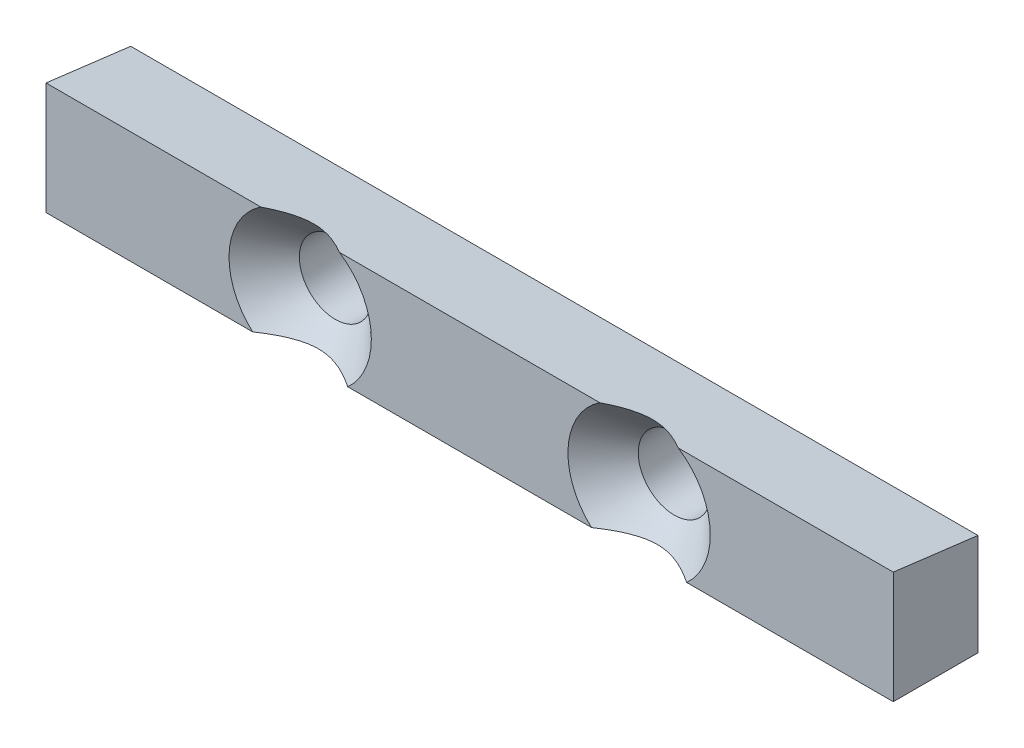
ISO-10303-21;
HEADER;
FILE_DESCRIPTION(('STEP AP214'),'2;1');
FILE_NAME('part.step','',(''),(''),'','','');
FILE_SCHEMA(('AUTOMOTIVE_DESIGN { 1 0 10303 214 1 1 1 1 }'));
ENDSEC;
DATA;
#1=APPLICATION_CONTEXT('core data for automotive mechanical design processes');
#2=APPLICATION_PROTOCOL_DEFINITION('international standard','automotive_design',2000,#1);
#3=PRODUCT_CONTEXT('',#1,'mechanical');
#4=PRODUCT('Part','Part','',(#3));
#5=PRODUCT_RELATED_PRODUCT_CATEGORY('part','',(#4));
#6=PRODUCT_DEFINITION_FORMATION('','',#4);
#7=PRODUCT_DEFINITION_CONTEXT('part definition',#1,'design');
#8=PRODUCT_DEFINITION('design','',#6,#7);
#9=PRODUCT_DEFINITION_SHAPE('','',#8);
#10=(LENGTH_UNIT() NAMED_UNIT(*) SI_UNIT(.MILLI.,.METRE.));
#11=(NAMED_UNIT(*) PLANE_ANGLE_UNIT() SI_UNIT($,.RADIAN.));
#12=(NAMED_UNIT(*) SI_UNIT($,.STERADIAN.) SOLID_ANGLE_UNIT());
#13=UNCERTAINTY_MEASURE_WITH_UNIT(LENGTH_MEASURE(1.E-05),#10,'distance_accuracy_value','');
#14=(GEOMETRIC_REPRESENTATION_CONTEXT(3) GLOBAL_UNCERTAINTY_ASSIGNED_CONTEXT((#13)) GLOBAL_UNIT_ASSIGNED_CONTEXT((#10,
#11,#12)) REPRESENTATION_CONTEXT('',''));
#15=CARTESIAN_POINT('',(0.,0.,0.));
#16=DIRECTION('',(0.,0.,1.));
#17=DIRECTION('',(1.,0.,0.));
#18=AXIS2_PLACEMENT_3D('',#15,#16,#17);
#19=CARTESIAN_POINT('',(0.,0.,4.));
#20=DIRECTION('',(0.,0.,-1.));
#21=DIRECTION('',(-1.,0.,0.));
#22=AXIS2_PLACEMENT_3D('',#19,#20,#21);
#23=PLANE('',#22);
#24=CARTESIAN_POINT('',(12.,2.5,4.));
#25=DIRECTION('',(0.,0.,1.));
#26=DIRECTION('',(1.,0.,0.));
#27=AXIS2_PLACEMENT_3D('',#24,#25,#26);
#28=CIRCLE('',#27,3.36);
#29=CARTESIAN_POINT('',(10.142690117401,5.3,4.));
#30=VERTEX_POINT('',#29);
#31=CARTESIAN_POINT('',(9.75509465678395,0.,4.));
#32=VERTEX_POINT('',#31);
#33=EDGE_CURVE('E54',#30,#32,#28,.T.);
#34=ORIENTED_EDGE('',*,*,#33,.F.);
#35=DIRECTION('',(-1.,0.,0.));
#36=VECTOR('',#35,1.);
#37=CARTESIAN_POINT('',(0.,5.3,4.));
#38=LINE('',#37,#36);
#39=CARTESIAN_POINT('',(0.,5.3,4.));
#40=VERTEX_POINT('',#39);
#41=EDGE_CURVE('E115',#30,#40,#38,.T.);
#42=ORIENTED_EDGE('',*,*,#41,.T.);
#43=DIRECTION('',(0.,-1.,0.));
#44=VECTOR('',#43,1.);
#45=CARTESIAN_POINT('',(0.,0.,4.));
#46=LINE('',#45,#44);
#47=CARTESIAN_POINT('',(0.,0.,4.));
#48=VERTEX_POINT('',#47);
#49=EDGE_CURVE('E137',#40,#48,#46,.T.);
#50=ORIENTED_EDGE('',*,*,#49,.T.);
#51=DIRECTION('',(1.,0.,0.));
#52=VECTOR('',#51,1.);
#53=CARTESIAN_POINT('',(0.,0.,4.));
#54=LINE('',#53,#52);
#55=EDGE_CURVE('E223',#48,#32,#54,.T.);
#56=ORIENTED_EDGE('',*,*,#55,.T.);
#57=EDGE_LOOP('',(#34,#42,#50,#56));
#58=FACE_BOUND('',#57,.T.);
#59=ADVANCED_FACE('F35',(#58),#23,.F.);
#60=CARTESIAN_POINT('',(14.2449053432161,0.,4.));
#61=VERTEX_POINT('',#60);
#62=CARTESIAN_POINT('',(13.857309882599,5.3,4.));
#63=VERTEX_POINT('',#62);
#64=EDGE_CURVE('E102',#61,#63,#28,.T.);
#65=ORIENTED_EDGE('',*,*,#64,.F.);
#66=CARTESIAN_POINT('',(25.755094656784,0.,4.));
#67=VERTEX_POINT('',#66);
#68=EDGE_CURVE('E61',#61,#67,#54,.T.);
#69=ORIENTED_EDGE('',*,*,#68,.T.);
#70=CARTESIAN_POINT('',(28.,2.5,4.));
#71=DIRECTION('',(0.,0.,1.));
#72=DIRECTION('',(1.,0.,0.));
#73=AXIS2_PLACEMENT_3D('',#70,#71,#72);
#74=CIRCLE('',#73,3.36);
#75=CARTESIAN_POINT('',(26.142690117401,5.3,4.));
#76=VERTEX_POINT('',#75);
#77=EDGE_CURVE('E120',#76,#67,#74,.T.);
#78=ORIENTED_EDGE('',*,*,#77,.F.);
#79=EDGE_CURVE('E113',#76,#63,#38,.T.);
#80=ORIENTED_EDGE('',*,*,#79,.T.);
#81=EDGE_LOOP('',(#65,#69,#78,#80));
#82=FACE_BOUND('',#81,.T.);
#83=ADVANCED_FACE('F119',(#82),#23,.F.);
#84=CARTESIAN_POINT('',(30.2449053432161,0.,4.));
#85=VERTEX_POINT('',#84);
#86=CARTESIAN_POINT('',(29.857309882599,5.3,4.));
#87=VERTEX_POINT('',#86);
#88=EDGE_CURVE('E116',#85,#87,#74,.T.);
#89=ORIENTED_EDGE('',*,*,#88,.F.);
#90=CARTESIAN_POINT('',(40.,0.,4.));
#91=VERTEX_POINT('',#90);
#92=EDGE_CURVE('E220',#85,#91,#54,.T.);
#93=ORIENTED_EDGE('',*,*,#92,.T.);
#94=DIRECTION('',(0.,1.,0.));
#95=VECTOR('',#94,1.);
#96=CARTESIAN_POINT('',(40.,0.,4.));
#97=LINE('',#96,#95);
#98=CARTESIAN_POINT('',(40.,5.3,4.));
#99=VERTEX_POINT('',#98);
#100=EDGE_CURVE('E125',#91,#99,#97,.T.);
#101=ORIENTED_EDGE('',*,*,#100,.T.);
#102=EDGE_CURVE('E121',#99,#87,#38,.T.);
#103=ORIENTED_EDGE('',*,*,#102,.T.);
#104=EDGE_LOOP('',(#89,#93,#101,#103));
#105=FACE_BOUND('',#104,.T.);
#106=ADVANCED_FACE('F168',(#105),#23,.F.);
#107=CARTESIAN_POINT('',(0.,0.,4.));
#108=DIRECTION('',(1.,0.,0.));
#109=DIRECTION('',(0.,0.,-1.));
#110=AXIS2_PLACEMENT_3D('',#107,#108,#109);
#111=PLANE('',#110);
#112=ORIENTED_EDGE('',*,*,#49,.F.);
#113=DIRECTION('',(0.,-0.124034734589208,-0.992277876713668));
#114=VECTOR('',#113,1.);
#115=CARTESIAN_POINT('',(0.,4.8,0.));
#116=LINE('',#115,#114);
#117=CARTESIAN_POINT('',(0.,4.8,0.));
#118=VERTEX_POINT('',#117);
#119=EDGE_CURVE('E212',#40,#118,#116,.T.);
#120=ORIENTED_EDGE('',*,*,#119,.T.);
#121=DIRECTION('',(0.,-1.,0.));
#122=VECTOR('',#121,1.);
#123=CARTESIAN_POINT('',(0.,0.,0.));
#124=LINE('',#123,#122);
#125=CARTESIAN_POINT('',(0.,0.,0.));
#126=VERTEX_POINT('',#125);
#127=EDGE_CURVE('E129',#118,#126,#124,.T.);
#128=ORIENTED_EDGE('',*,*,#127,.T.);
#129=DIRECTION('',(0.,0.,-1.));
#130=VECTOR('',#129,1.);
#131=CARTESIAN_POINT('',(0.,0.,4.));
#132=LINE('',#131,#130);
#133=EDGE_CURVE('E140',#48,#126,#132,.T.);
#134=ORIENTED_EDGE('',*,*,#133,.F.);
#135=EDGE_LOOP('',(#112,#120,#128,#134));
#136=FACE_BOUND('',#135,.T.);
#137=ADVANCED_FACE('F37',(#136),#111,.F.);
#138=CARTESIAN_POINT('',(0.,0.,4.));
#139=DIRECTION('',(0.,1.,0.));
#140=DIRECTION('',(0.,0.,1.));
#141=AXIS2_PLACEMENT_3D('',#138,#139,#140);
#142=PLANE('',#141);
#143=ORIENTED_EDGE('',*,*,#68,.F.);
#144=CARTESIAN_POINT('',(7.10959414267506,0.,6.13236465007179));
#145=CARTESIAN_POINT('',(7.22257672798043,0.,6.03178052000878));
#146=CARTESIAN_POINT('',(7.33590490392407,0.,5.93158089696772));
#147=CARTESIAN_POINT('',(7.56343593333905,0.,5.73215625210405));
#148=CARTESIAN_POINT('',(7.67763887687024,0.,5.63293133309703));
#149=CARTESIAN_POINT('',(7.90756722529896,0.,5.43526341119713));
#150=CARTESIAN_POINT('',(8.02329703901976,0.,5.33682552709668));
#151=CARTESIAN_POINT('',(8.25603143741055,0.,5.14147696706215));
#152=CARTESIAN_POINT('',(8.37303596138781,0.,5.04456621894948));
#153=CARTESIAN_POINT('',(8.61550039812195,0.,4.84708900389199));
#154=CARTESIAN_POINT('',(8.7410554428895,0.,4.74663899146112));
#155=CARTESIAN_POINT('',(8.99441364950858,0.,4.54861817784382));
#156=CARTESIAN_POINT('',(9.12221667016262,0.,4.45104719684616));
#157=CARTESIAN_POINT('',(9.38050552195276,0.,4.25997314367807));
#158=CARTESIAN_POINT('',(9.5109864117464,0.,4.16646342460601));
#159=CARTESIAN_POINT('',(9.77566943198212,0.,3.98489838633695));
#160=CARTESIAN_POINT('',(9.90987023405457,0.,3.89684115549075));
#161=CARTESIAN_POINT('',(10.1424054126427,0.,3.75367499047655));
#162=CARTESIAN_POINT('',(10.2395045849948,0.,3.69656988049931));
#163=CARTESIAN_POINT('',(10.4365966693813,0.,3.58745400729232));
#164=CARTESIAN_POINT('',(10.5365904938607,0.,3.53544487356239));
#165=CARTESIAN_POINT('',(10.7390152956502,0.,3.43861547546684));
#166=CARTESIAN_POINT('',(10.8414190155523,0.,3.39373890977025));
#167=CARTESIAN_POINT('',(11.0496687589402,0.,3.31281715643526));
#168=CARTESIAN_POINT('',(11.1555124646676,0.,3.2767661566176));
#169=CARTESIAN_POINT('',(11.3357110529208,0.,3.22580962828511));
#170=CARTESIAN_POINT('',(11.409196614111,0.,3.20783514047001));
#171=CARTESIAN_POINT('',(11.5573815379837,0.,3.17784412026151));
#172=CARTESIAN_POINT('',(11.6320806900963,0.,3.16582656544739));
#173=CARTESIAN_POINT('',(11.782038709295,0.,3.14838201335273));
#174=CARTESIAN_POINT('',(11.8572953618472,0.,3.14293624727558));
#175=CARTESIAN_POINT('',(12.0079967110219,0.,3.13887804612208));
#176=CARTESIAN_POINT('',(12.0834414091559,0.,3.14026566615237));
#177=CARTESIAN_POINT('',(12.2337715726226,0.,3.14978663579495));
#178=CARTESIAN_POINT('',(12.3086577558612,0.,3.15790883876889));
#179=CARTESIAN_POINT('',(12.4574805374939,0.,3.18044740431064));
#180=CARTESIAN_POINT('',(12.5314169039774,0.,3.19486527507422));
#181=CARTESIAN_POINT('',(12.6782289890921,0.,3.2293784091974));
#182=CARTESIAN_POINT('',(12.7510996695197,0.,3.24949483254387));
#183=CARTESIAN_POINT('',(12.8952999249293,0.,3.29459403665136));
#184=CARTESIAN_POINT('',(12.9666295034499,0.,3.31957680623691));
#185=CARTESIAN_POINT('',(13.1287020310676,0.,3.38168094109262));
#186=CARTESIAN_POINT('',(13.2189059246737,0.,3.42020223919005));
#187=CARTESIAN_POINT('',(13.3968165345856,0.,3.5026697227687));
#188=CARTESIAN_POINT('',(13.4845219766713,0.,3.54661861747562));
#189=CARTESIAN_POINT('',(13.6578209416963,0.,3.63882962992385));
#190=CARTESIAN_POINT('',(13.7434103701994,0.,3.68709938415843));
#191=CARTESIAN_POINT('',(13.9126225183037,0.,3.78697653409325));
#192=CARTESIAN_POINT('',(13.9962449490223,0.,3.8385844159245));
#193=CARTESIAN_POINT('',(14.1629672301914,0.,3.94518719536535));
#194=CARTESIAN_POINT('',(14.246042922412,0.,4.0002196999381));
#195=CARTESIAN_POINT('',(14.4107153618265,0.,4.11245164566018));
#196=CARTESIAN_POINT('',(14.4923120634171,0.,4.16965115345958));
#197=CARTESIAN_POINT('',(14.6541501411505,0.,4.28572850346679));
#198=CARTESIAN_POINT('',(14.7343930349436,0.,4.34460423557995));
#199=CARTESIAN_POINT('',(14.8938045669698,0.,4.46378259304233));
#200=CARTESIAN_POINT('',(14.9729732449495,0.,4.52408516536975));
#201=CARTESIAN_POINT('',(15.2392041226513,0.,4.73001613607985));
#202=CARTESIAN_POINT('',(15.4241512394478,0.,4.87837846272881));
#203=CARTESIAN_POINT('',(15.790463552772,0.,5.17947244746726));
#204=CARTESIAN_POINT('',(15.9718282272428,0.,5.33220473455044));
#205=CARTESIAN_POINT('',(16.3320179881399,0.,5.64077530119658));
#206=CARTESIAN_POINT('',(16.5108420116084,0.,5.79661481882453));
#207=CARTESIAN_POINT('',(16.8665489711859,0.,6.11049493137844));
#208=CARTESIAN_POINT('',(17.0434318641744,0.,6.26853557502424));
#209=CARTESIAN_POINT('',(17.3960668912952,0.,6.58657281556075));
#210=CARTESIAN_POINT('',(17.5718160759396,0.,6.74657267807653));
#211=CARTESIAN_POINT('',(17.922157407742,0.,7.06783701859497));
#212=CARTESIAN_POINT('',(18.0967495397651,0.,7.22910151307982));
#213=CARTESIAN_POINT('',(18.6190739374147,0.,7.71427592162699));
#214=CARTESIAN_POINT('',(18.9654457045477,0.,8.03964986043551));
#215=CARTESIAN_POINT('',(19.615033033535,0.,8.65430976916825));
#216=CARTESIAN_POINT('',(19.918512549118,0.,8.94331770902425));
#217=CARTESIAN_POINT('',(20.5241520941546,0.,9.52275864842428));
#218=CARTESIAN_POINT('',(20.8263120211772,0.,9.81319175500504));
#219=CARTESIAN_POINT('',(21.4286098153499,0.,10.3940946663167));
#220=CARTESIAN_POINT('',(21.728751064172,0.,10.6845609683965));
#221=CARTESIAN_POINT('',(22.3282392584971,0.,11.2662605142661));
#222=CARTESIAN_POINT('',(22.627586270425,0.,11.5574936895821));
#223=CARTESIAN_POINT('',(22.9266582195433,0.,11.8490079778147));
#224=B_SPLINE_CURVE_WITH_KNOTS('',3,(#144,#145,#146,#147,#148,#149,#150,#151,#152,#153,#154,
#155,#156,#157,#158,#159,#160,#161,#162,#163,#164,#165,#166,#167,#168,#169,#170,#171,#172,#173,
#174,#175,#176,#177,#178,#179,#180,#181,#182,#183,#184,#185,#186,#187,#188,#189,#190,#191,#192,
#193,#194,#195,#196,#197,#198,#199,#200,#201,#202,#203,#204,#205,#206,#207,#208,#209,#210,#211,
#212,#213,#214,#215,#216,#217,#218,#219,#220,#221,#222,#223),.UNSPECIFIED.,.F.,.F.,(4,2,2,2,2,2,
2,2,2,2,2,2,2,2,2,2,2,2,2,2,2,2,2,2,2,2,2,2,2,2,2,2,2,2,2,2,2,2,2,4),(0.,0.453808990384154,
0.90766534707691,1.36345154225588,1.81921613013577,2.3015633536554,2.7838803879218,
3.26537574846373,3.74670132895608,4.08452829548979,4.42246293612783,4.75758114303718,
5.09247805663566,5.3192246684038,5.54593234893411,5.77199101628344,5.99805150664621,
6.22373858171185,6.44947975226144,6.67607039161984,6.90266051062348,7.19667515732273,
7.4908371613646,7.78552972511355,8.08026530194202,8.37917349103521,8.67809088106391,
8.97664731094404,9.27519266375084,9.98637551852314,10.6976612580878,11.409236306309,
12.1208271296812,12.8338335548878,13.546849288346,14.9725099701014,16.2297361351801,
17.4870582149406,18.7400926237266,19.9930187065082),.UNSPECIFIED.);
#225=EDGE_CURVE('E11',#61,#32,#224,.F.);
#226=ORIENTED_EDGE('',*,*,#225,.T.);
#227=ORIENTED_EDGE('',*,*,#55,.F.);
#228=ORIENTED_EDGE('',*,*,#133,.T.);
#229=DIRECTION('',(1.,0.,0.));
#230=VECTOR('',#229,1.);
#231=CARTESIAN_POINT('',(0.,0.,0.));
#232=LINE('',#231,#230);
#233=CARTESIAN_POINT('',(40.,0.,0.));
#234=VERTEX_POINT('',#233);
#235=EDGE_CURVE('E131',#126,#234,#232,.T.);
#236=ORIENTED_EDGE('',*,*,#235,.T.);
#237=DIRECTION('',(0.,0.,-1.));
#238=VECTOR('',#237,1.);
#239=CARTESIAN_POINT('',(40.,0.,4.));
#240=LINE('',#239,#238);
#241=EDGE_CURVE('E124',#91,#234,#240,.T.);
#242=ORIENTED_EDGE('',*,*,#241,.F.);
#243=ORIENTED_EDGE('',*,*,#92,.F.);
#244=CARTESIAN_POINT('',(23.1095941426751,0.,6.13236465007179));
#245=CARTESIAN_POINT('',(23.2225767279804,0.,6.03178052000878));
#246=CARTESIAN_POINT('',(23.3359049039241,0.,5.93158089696772));
#247=CARTESIAN_POINT('',(23.5634359333391,0.,5.73215625210406));
#248=CARTESIAN_POINT('',(23.6776388768702,0.,5.63293133309703));
#249=CARTESIAN_POINT('',(23.907567225299,0.,5.43526341119713));
#250=CARTESIAN_POINT('',(24.0232970390198,0.,5.33682552709668));
#251=CARTESIAN_POINT('',(24.2560314374105,0.,5.14147696706216));
#252=CARTESIAN_POINT('',(24.3730359613878,0.,5.04456621894949));
#253=CARTESIAN_POINT('',(24.615500398122,0.,4.84708900389199));
#254=CARTESIAN_POINT('',(24.7410554428895,0.,4.74663899146113));
#255=CARTESIAN_POINT('',(24.9944136495086,0.,4.54861817784382));
#256=CARTESIAN_POINT('',(25.1222166701626,0.,4.45104719684617));
#257=CARTESIAN_POINT('',(25.3805055219528,0.,4.25997314367807));
#258=CARTESIAN_POINT('',(25.5109864117464,0.,4.16646342460602));
#259=CARTESIAN_POINT('',(25.7756694319821,0.,3.98489838633695));
#260=CARTESIAN_POINT('',(25.9098702340546,0.,3.89684115549075));
#261=CARTESIAN_POINT('',(26.1424054126427,0.,3.75367499047655));
#262=CARTESIAN_POINT('',(26.2395045849948,0.,3.69656988049931));
#263=CARTESIAN_POINT('',(26.4365966693813,0.,3.58745400729232));
#264=CARTESIAN_POINT('',(26.5365904938607,0.,3.5354448735624));
#265=CARTESIAN_POINT('',(26.7390152956502,0.,3.43861547546684));
#266=CARTESIAN_POINT('',(26.8414190155524,0.,3.39373890977025));
#267=CARTESIAN_POINT('',(27.0496687589402,0.,3.31281715643526));
#268=CARTESIAN_POINT('',(27.1555124646676,0.,3.2767661566176));
#269=CARTESIAN_POINT('',(27.3357110529208,0.,3.22580962828512));
#270=CARTESIAN_POINT('',(27.409196614111,0.,3.20783514047002));
#271=CARTESIAN_POINT('',(27.5573815379837,0.,3.17784412026151));
#272=CARTESIAN_POINT('',(27.6320806900963,0.,3.16582656544739));
#273=CARTESIAN_POINT('',(27.782038709295,0.,3.14838201335273));
#274=CARTESIAN_POINT('',(27.8572953618472,0.,3.14293624727558));
#275=CARTESIAN_POINT('',(28.0079967110219,0.,3.13887804612208));
#276=CARTESIAN_POINT('',(28.0834414091559,0.,3.14026566615237));
#277=CARTESIAN_POINT('',(28.2337715726226,0.,3.14978663579495));
#278=CARTESIAN_POINT('',(28.3086577558612,0.,3.1579088387689));
#279=CARTESIAN_POINT('',(28.4574805374939,0.,3.18044740431064));
#280=CARTESIAN_POINT('',(28.5314169039774,0.,3.19486527507422));
#281=CARTESIAN_POINT('',(28.6782289890921,0.,3.2293784091974));
#282=CARTESIAN_POINT('',(28.7510996695197,0.,3.24949483254388));
#283=CARTESIAN_POINT('',(28.8952999249293,0.,3.29459403665136));
#284=CARTESIAN_POINT('',(28.9666295034499,0.,3.31957680623691));
#285=CARTESIAN_POINT('',(29.1287020310676,0.,3.38168094109263));
#286=CARTESIAN_POINT('',(29.2189059246737,0.,3.42020223919005));
#287=CARTESIAN_POINT('',(29.3968165345856,0.,3.50266972276871));
#288=CARTESIAN_POINT('',(29.4845219766713,0.,3.54661861747562));
#289=CARTESIAN_POINT('',(29.6578209416963,0.,3.63882962992386));
#290=CARTESIAN_POINT('',(29.7434103701994,0.,3.68709938415844));
#291=CARTESIAN_POINT('',(29.9126225183037,0.,3.78697653409326));
#292=CARTESIAN_POINT('',(29.9962449490224,0.,3.83858441592451));
#293=CARTESIAN_POINT('',(30.1629672301914,0.,3.94518719536536));
#294=CARTESIAN_POINT('',(30.246042922412,0.,4.00021969993811));
#295=CARTESIAN_POINT('',(30.4107153618266,0.,4.11245164566019));
#296=CARTESIAN_POINT('',(30.4923120634171,0.,4.16965115345959));
#297=CARTESIAN_POINT('',(30.6541501411505,0.,4.2857285034668));
#298=CARTESIAN_POINT('',(30.7343930349436,0.,4.34460423557997));
#299=CARTESIAN_POINT('',(30.8938045669698,0.,4.46378259304235));
#300=CARTESIAN_POINT('',(30.9729732449495,0.,4.52408516536977));
#301=CARTESIAN_POINT('',(31.2392041226514,0.,4.73001613607986));
#302=CARTESIAN_POINT('',(31.4241512394478,0.,4.87837846272883));
#303=CARTESIAN_POINT('',(31.790463552772,0.,5.17947244746727));
#304=CARTESIAN_POINT('',(31.9718282272428,0.,5.33220473455045));
#305=CARTESIAN_POINT('',(32.3320179881399,0.,5.64077530119659));
#306=CARTESIAN_POINT('',(32.5108420116084,0.,5.79661481882454));
#307=CARTESIAN_POINT('',(32.8665489711859,0.,6.11049493137845));
#308=CARTESIAN_POINT('',(33.0434318641744,0.,6.26853557502425));
#309=CARTESIAN_POINT('',(33.3960668912953,0.,6.58657281556077));
#310=CARTESIAN_POINT('',(33.5718160759396,0.,6.74657267807655));
#311=CARTESIAN_POINT('',(33.922157407742,0.,7.06783701859499));
#312=CARTESIAN_POINT('',(34.0967495397651,0.,7.22910151307984));
#313=CARTESIAN_POINT('',(34.6190739374148,0.,7.71427592162701));
#314=CARTESIAN_POINT('',(34.9654457045477,0.,8.03964986043554));
#315=CARTESIAN_POINT('',(35.615033033535,0.,8.65430976916829));
#316=CARTESIAN_POINT('',(35.9185125491181,0.,8.94331770902428));
#317=CARTESIAN_POINT('',(36.5241520941546,0.,9.52275864842432));
#318=CARTESIAN_POINT('',(36.8263120211772,0.,9.81319175500508));
#319=CARTESIAN_POINT('',(37.4286098153499,0.,10.3940946663168));
#320=CARTESIAN_POINT('',(37.7287510641721,0.,10.6845609683966));
#321=CARTESIAN_POINT('',(38.3282392584971,0.,11.2662605142661));
#322=CARTESIAN_POINT('',(38.6275862704251,0.,11.5574936895822));
#323=CARTESIAN_POINT('',(38.9266582195434,0.,11.8490079778148));
#324=B_SPLINE_CURVE_WITH_KNOTS('',3,(#244,#245,#246,#247,#248,#249,#250,#251,#252,#253,#254,
#255,#256,#257,#258,#259,#260,#261,#262,#263,#264,#265,#266,#267,#268,#269,#270,#271,#272,#273,
#274,#275,#276,#277,#278,#279,#280,#281,#282,#283,#284,#285,#286,#287,#288,#289,#290,#291,#292,
#293,#294,#295,#296,#297,#298,#299,#300,#301,#302,#303,#304,#305,#306,#307,#308,#309,#310,#311,
#312,#313,#314,#315,#316,#317,#318,#319,#320,#321,#322,#323),.UNSPECIFIED.,.F.,.F.,(4,2,2,2,2,2,
2,2,2,2,2,2,2,2,2,2,2,2,2,2,2,2,2,2,2,2,2,2,2,2,2,2,2,2,2,2,2,2,2,4),(0.,0.453808990384152,
0.907665347076912,1.36345154225588,1.81921613013577,2.3015633536554,2.7838803879218,
3.26537574846373,3.74670132895608,4.08452829548979,4.42246293612783,4.75758114303718,
5.09247805663566,5.3192246684038,5.5459323489341,5.77199101628344,5.99805150664621,
6.22373858171184,6.44947975226144,6.67607039161985,6.90266051062348,7.19667515732273,
7.4908371613646,7.78552972511356,8.08026530194202,8.37917349103522,8.67809088106392,
8.97664731094405,9.27519266375085,9.98637551852315,10.6976612580878,11.409236306309,
12.1208271296812,12.8338335548878,13.546849288346,14.9725099701014,16.2297361351802,
17.4870582149406,18.7400926237266,19.9930187065083),.UNSPECIFIED.);
#325=EDGE_CURVE('E47',#85,#67,#324,.F.);
#326=ORIENTED_EDGE('',*,*,#325,.T.);
#327=EDGE_LOOP('',(#143,#226,#227,#228,#236,#242,#243,#326));
#328=FACE_BOUND('',#327,.T.);
#329=ADVANCED_FACE('F151',(#328),#142,.F.);
#330=CARTESIAN_POINT('',(40.,0.,4.));
#331=DIRECTION('',(-1.,0.,0.));
#332=DIRECTION('',(0.,0.,1.));
#333=AXIS2_PLACEMENT_3D('',#330,#331,#332);
#334=PLANE('',#333);
#335=DIRECTION('',(0.,1.,0.));
#336=VECTOR('',#335,1.);
#337=CARTESIAN_POINT('',(40.,0.,0.));
#338=LINE('',#337,#336);
#339=CARTESIAN_POINT('',(40.,4.8,0.));
#340=VERTEX_POINT('',#339);
#341=EDGE_CURVE('E134',#234,#340,#338,.T.);
#342=ORIENTED_EDGE('',*,*,#341,.T.);
#343=DIRECTION('',(0.,-0.124034734589208,-0.992277876713668));
#344=VECTOR('',#343,1.);
#345=CARTESIAN_POINT('',(40.,4.8,0.));
#346=LINE('',#345,#344);
#347=EDGE_CURVE('E216',#99,#340,#346,.T.);
#348=ORIENTED_EDGE('',*,*,#347,.F.);
#349=ORIENTED_EDGE('',*,*,#100,.F.);
#350=ORIENTED_EDGE('',*,*,#241,.T.);
#351=EDGE_LOOP('',(#342,#348,#349,#350));
#352=FACE_BOUND('',#351,.T.);
#353=ADVANCED_FACE('F155',(#352),#334,.F.);
#354=CARTESIAN_POINT('',(0.,0.,0.));
#355=DIRECTION('',(0.,0.,-1.));
#356=DIRECTION('',(-1.,0.,0.));
#357=AXIS2_PLACEMENT_3D('',#354,#355,#356);
#358=PLANE('',#357);
#359=CARTESIAN_POINT('',(12.,2.5,0.));
#360=DIRECTION('',(0.,0.,1.));
#361=DIRECTION('',(1.,0.,0.));
#362=AXIS2_PLACEMENT_3D('',#359,#360,#361);
#363=CIRCLE('',#362,1.7);
#364=CARTESIAN_POINT('',(13.7,2.5,0.));
#365=VERTEX_POINT('',#364);
#366=EDGE_CURVE('E117',#365,#365,#363,.T.);
#367=ORIENTED_EDGE('',*,*,#366,.T.);
#368=EDGE_LOOP('',(#367));
#369=FACE_BOUND('',#368,.T.);
#370=CARTESIAN_POINT('',(28.,2.5,0.));
#371=DIRECTION('',(0.,0.,1.));
#372=DIRECTION('',(1.,0.,0.));
#373=AXIS2_PLACEMENT_3D('',#370,#371,#372);
#374=CIRCLE('',#373,1.7);
#375=CARTESIAN_POINT('',(29.7,2.5,0.));
#376=VERTEX_POINT('',#375);
#377=EDGE_CURVE('E206',#376,#376,#374,.T.);
#378=ORIENTED_EDGE('',*,*,#377,.T.);
#379=EDGE_LOOP('',(#378));
#380=FACE_BOUND('',#379,.T.);
#381=DIRECTION('',(1.,0.,0.));
#382=VECTOR('',#381,1.);
#383=CARTESIAN_POINT('',(0.,4.8,0.));
#384=LINE('',#383,#382);
#385=EDGE_CURVE('E132',#118,#340,#384,.T.);
#386=ORIENTED_EDGE('',*,*,#385,.T.);
#387=ORIENTED_EDGE('',*,*,#341,.F.);
#388=ORIENTED_EDGE('',*,*,#235,.F.);
#389=ORIENTED_EDGE('',*,*,#127,.F.);
#390=EDGE_LOOP('',(#386,#387,#388,#389));
#391=FACE_BOUND('',#390,.T.);
#392=ADVANCED_FACE('F160',(#369,#380,#391),#358,.T.);
#393=CARTESIAN_POINT('',(0.,4.8,0.));
#394=DIRECTION('',(0.,-0.992277876713668,0.124034734589208));
#395=DIRECTION('',(0.,-0.124034734589208,-0.992277876713668));
#396=AXIS2_PLACEMENT_3D('',#393,#394,#395);
#397=PLANE('',#396);
#398=ORIENTED_EDGE('',*,*,#41,.F.);
#399=CARTESIAN_POINT('',(10.1423660103844,5.300025,4.00020000000001));
#400=CARTESIAN_POINT('',(10.2324850911804,5.29308202303116,3.9446561842493));
#401=CARTESIAN_POINT('',(10.3237538022026,5.28634963798703,3.89079710389623));
#402=CARTESIAN_POINT('',(10.5093883813349,5.27345957653499,3.78767661227989));
#403=CARTESIAN_POINT('',(10.6037657785271,5.26730446824696,3.7384357459757));
#404=CARTESIAN_POINT('',(10.7976538941815,5.25566471364756,3.64531770918051));
#405=CARTESIAN_POINT('',(10.8972305897643,5.25019670318609,3.60157362548875));
#406=CARTESIAN_POINT('',(11.0997705957393,5.24036701424602,3.52293611396819));
#407=CARTESIAN_POINT('',(11.2027279310164,5.23600349123032,3.48802792984253));
#408=CARTESIAN_POINT('',(11.3763036778863,5.22993651641221,3.43949213129772));
#409=CARTESIAN_POINT('',(11.446012370964,5.22783308882905,3.42266471063238));
#410=CARTESIAN_POINT('',(11.5865944520669,5.22433242554746,3.39465940437965));
#411=CARTESIAN_POINT('',(11.6574678592965,5.22293520150532,3.38348161204258));
#412=CARTESIAN_POINT('',(11.799246589357,5.22092796095396,3.36742368763167));
#413=CARTESIAN_POINT('',(11.870144892348,5.22031041745849,3.36248333966794));
#414=CARTESIAN_POINT('',(12.0121005080351,5.21987162111771,3.35897296894165));
#415=CARTESIAN_POINT('',(12.0831578129063,5.22005032991206,3.36040263929644));
#416=CARTESIAN_POINT('',(12.2247901907448,5.22119355785538,3.36954846284301));
#417=CARTESIAN_POINT('',(12.2953656477026,5.22215735283345,3.37725882266759));
#418=CARTESIAN_POINT('',(12.4355972139484,5.22481798094261,3.39854384754084));
#419=CARTESIAN_POINT('',(12.5052532240258,5.22651489252313,3.41211914018506));
#420=CARTESIAN_POINT('',(12.7135674731773,5.23262638684489,3.4610110947591));
#421=CARTESIAN_POINT('',(12.8503344766864,5.23804952136439,3.50439617091508));
#422=CARTESIAN_POINT('',(13.0611496003451,5.24812656586356,3.5850125269085));
#423=CARTESIAN_POINT('',(13.1373265512529,5.25214057812713,3.61712462501704));
#424=CARTESIAN_POINT('',(13.2877936446517,5.26069305464613,3.68554443716904));
#425=CARTESIAN_POINT('',(13.36208301624,5.26523172910805,3.72185383286444));
#426=CARTESIAN_POINT('',(13.5074723276236,5.27463697119462,3.79709576955697));
#427=CARTESIAN_POINT('',(13.5786060955994,5.27949560373331,3.83596482986649));
#428=CARTESIAN_POINT('',(13.7192576371857,5.28953558210145,3.91628465681157));
#429=CARTESIAN_POINT('',(13.7887774109215,5.29471649560752,3.95773196486014));
#430=CARTESIAN_POINT('',(13.8576339896156,5.300025,4.00020000000001));
#431=B_SPLINE_CURVE_WITH_KNOTS('',3,(#399,#400,#401,#402,#403,#404,#405,#406,#407,#408,#409,
#410,#411,#412,#413,#414,#415,#416,#417,#418,#419,#420,#421,#422,#423,#424,#425,#426,#427,#428,
#429,#430),.UNSPECIFIED.,.F.,.F.,(4,2,2,2,2,2,2,2,2,2,2,2,2,2,2,4),(0.,0.318368564287928,
0.638092212293683,0.964475529263863,1.29031012257836,1.50533428061374,1.72036198762931,
1.93329754969279,2.14622285346139,2.35895197502729,2.57170386598078,3.00088898042569,
3.24910039726989,3.49741160723414,3.74097186602459,3.98421216706724),.UNSPECIFIED.);
#432=EDGE_CURVE('E105',#30,#63,#431,.T.);
#433=ORIENTED_EDGE('',*,*,#432,.T.);
#434=ORIENTED_EDGE('',*,*,#79,.F.);
#435=CARTESIAN_POINT('',(26.1423660103844,5.300025,4.00020000000001));
#436=CARTESIAN_POINT('',(26.2324850911804,5.29308202303116,3.9446561842493));
#437=CARTESIAN_POINT('',(26.3237538022025,5.28634963798703,3.89079710389623));
#438=CARTESIAN_POINT('',(26.5093883813349,5.27345957653499,3.78767661227989));
#439=CARTESIAN_POINT('',(26.6037657785271,5.26730446824696,3.7384357459757));
#440=CARTESIAN_POINT('',(26.7976538941815,5.25566471364756,3.64531770918051));
#441=CARTESIAN_POINT('',(26.8972305897643,5.25019670318609,3.60157362548875));
#442=CARTESIAN_POINT('',(27.0997705957393,5.24036701424602,3.52293611396819));
#443=CARTESIAN_POINT('',(27.2027279310164,5.23600349123032,3.48802792984253));
#444=CARTESIAN_POINT('',(27.3763036778863,5.22993651641221,3.43949213129772));
#445=CARTESIAN_POINT('',(27.446012370964,5.22783308882905,3.42266471063238));
#446=CARTESIAN_POINT('',(27.5865944520669,5.22433242554746,3.39465940437965));
#447=CARTESIAN_POINT('',(27.6574678592965,5.22293520150532,3.38348161204258));
#448=CARTESIAN_POINT('',(27.799246589357,5.22092796095396,3.36742368763167));
#449=CARTESIAN_POINT('',(27.870144892348,5.22031041745849,3.36248333966794));
#450=CARTESIAN_POINT('',(28.0121005080351,5.21987162111771,3.35897296894165));
#451=CARTESIAN_POINT('',(28.0831578129063,5.22005032991206,3.36040263929644));
#452=CARTESIAN_POINT('',(28.2247901907448,5.22119355785538,3.36954846284301));
#453=CARTESIAN_POINT('',(28.2953656477026,5.22215735283345,3.37725882266759));
#454=CARTESIAN_POINT('',(28.4355972139484,5.22481798094261,3.39854384754084));
#455=CARTESIAN_POINT('',(28.5052532240258,5.22651489252313,3.41211914018506));
#456=CARTESIAN_POINT('',(28.7135674731773,5.23262638684489,3.4610110947591));
#457=CARTESIAN_POINT('',(28.8503344766864,5.23804952136438,3.50439617091508));
#458=CARTESIAN_POINT('',(29.0611496003451,5.24812656586356,3.5850125269085));
#459=CARTESIAN_POINT('',(29.1373265512529,5.25214057812713,3.61712462501704));
#460=CARTESIAN_POINT('',(29.2877936446517,5.26069305464613,3.68554443716904));
#461=CARTESIAN_POINT('',(29.36208301624,5.26523172910805,3.72185383286444));
#462=CARTESIAN_POINT('',(29.5074723276236,5.27463697119462,3.79709576955697));
#463=CARTESIAN_POINT('',(29.5786060955994,5.27949560373331,3.83596482986649));
#464=CARTESIAN_POINT('',(29.7192576371857,5.28953558210145,3.91628465681157));
#465=CARTESIAN_POINT('',(29.7887774109215,5.29471649560752,3.95773196486014));
#466=CARTESIAN_POINT('',(29.8576339896156,5.300025,4.00020000000001));
#467=B_SPLINE_CURVE_WITH_KNOTS('',3,(#435,#436,#437,#438,#439,#440,#441,#442,#443,#444,#445,
#446,#447,#448,#449,#450,#451,#452,#453,#454,#455,#456,#457,#458,#459,#460,#461,#462,#463,#464,
#465,#466),.UNSPECIFIED.,.F.,.F.,(4,2,2,2,2,2,2,2,2,2,2,2,2,2,2,4),(0.,0.318368564287928,
0.638092212293681,0.964475529263858,1.29031012257836,1.50533428061374,1.7203619876293,
1.93329754969278,2.14622285346139,2.35895197502729,2.57170386598077,3.00088898042568,
3.24910039726989,3.49741160723414,3.74097186602459,3.98421216706724),.UNSPECIFIED.);
#468=EDGE_CURVE('E174',#76,#87,#467,.T.);
#469=ORIENTED_EDGE('',*,*,#468,.T.);
#470=ORIENTED_EDGE('',*,*,#102,.F.);
#471=ORIENTED_EDGE('',*,*,#347,.T.);
#472=ORIENTED_EDGE('',*,*,#385,.F.);
#473=ORIENTED_EDGE('',*,*,#119,.F.);
#474=EDGE_LOOP('',(#398,#433,#434,#469,#470,#471,#472,#473));
#475=FACE_BOUND('',#474,.T.);
#476=ADVANCED_FACE('F111',(#475),#397,.F.);
#477=CARTESIAN_POINT('',(28.,2.5,4.));
#478=DIRECTION('',(0.,0.,1.));
#479=DIRECTION('',(1.,0.,0.));
#480=AXIS2_PLACEMENT_3D('',#477,#478,#479);
#481=CONICAL_SURFACE('',#480,3.36,0.785398163397448);
#482=CARTESIAN_POINT('',(28.,2.5,2.34));
#483=DIRECTION('',(0.,0.,1.));
#484=DIRECTION('',(1.,0.,0.));
#485=AXIS2_PLACEMENT_3D('',#482,#483,#484);
#486=CIRCLE('',#485,1.7);
#487=CARTESIAN_POINT('',(29.7,2.5,2.34));
#488=VERTEX_POINT('',#487);
#489=EDGE_CURVE('E232',#488,#488,#486,.T.);
#490=ORIENTED_EDGE('',*,*,#489,.F.);
#491=EDGE_LOOP('',(#490));
#492=FACE_BOUND('',#491,.T.);
#493=ORIENTED_EDGE('',*,*,#77,.T.);
#494=ORIENTED_EDGE('',*,*,#325,.F.);
#495=ORIENTED_EDGE('',*,*,#88,.T.);
#496=ORIENTED_EDGE('',*,*,#468,.F.);
#497=EDGE_LOOP('',(#493,#494,#495,#496));
#498=FACE_BOUND('',#497,.T.);
#499=ADVANCED_FACE('F147',(#492,#498),#481,.F.);
#500=CARTESIAN_POINT('',(28.,2.5,4.));
#501=DIRECTION('',(0.,0.,1.));
#502=DIRECTION('',(1.,0.,0.));
#503=AXIS2_PLACEMENT_3D('',#500,#501,#502);
#504=CYLINDRICAL_SURFACE('',#503,1.7);
#505=ORIENTED_EDGE('',*,*,#377,.F.);
#506=EDGE_LOOP('',(#505));
#507=FACE_BOUND('',#506,.T.);
#508=ORIENTED_EDGE('',*,*,#489,.T.);
#509=EDGE_LOOP('',(#508));
#510=FACE_BOUND('',#509,.T.);
#511=ADVANCED_FACE('F171',(#507,#510),#504,.F.);
#512=CARTESIAN_POINT('',(12.,2.5,4.));
#513=DIRECTION('',(0.,0.,1.));
#514=DIRECTION('',(1.,0.,0.));
#515=AXIS2_PLACEMENT_3D('',#512,#513,#514);
#516=CONICAL_SURFACE('',#515,3.36,0.785398163397448);
#517=CARTESIAN_POINT('',(12.,2.5,2.34));
#518=DIRECTION('',(0.,0.,1.));
#519=DIRECTION('',(1.,0.,0.));
#520=AXIS2_PLACEMENT_3D('',#517,#518,#519);
#521=CIRCLE('',#520,1.7);
#522=CARTESIAN_POINT('',(13.7,2.5,2.34));
#523=VERTEX_POINT('',#522);
#524=EDGE_CURVE('E201',#523,#523,#521,.T.);
#525=ORIENTED_EDGE('',*,*,#524,.F.);
#526=EDGE_LOOP('',(#525));
#527=FACE_BOUND('',#526,.T.);
#528=ORIENTED_EDGE('',*,*,#33,.T.);
#529=ORIENTED_EDGE('',*,*,#225,.F.);
#530=ORIENTED_EDGE('',*,*,#64,.T.);
#531=ORIENTED_EDGE('',*,*,#432,.F.);
#532=EDGE_LOOP('',(#528,#529,#530,#531));
#533=FACE_BOUND('',#532,.T.);
#534=ADVANCED_FACE('F104',(#527,#533),#516,.F.);
#535=CARTESIAN_POINT('',(12.,2.5,4.));
#536=DIRECTION('',(0.,0.,1.));
#537=DIRECTION('',(1.,0.,0.));
#538=AXIS2_PLACEMENT_3D('',#535,#536,#537);
#539=CYLINDRICAL_SURFACE('',#538,1.7);
#540=ORIENTED_EDGE('',*,*,#366,.F.);
#541=EDGE_LOOP('',(#540));
#542=FACE_BOUND('',#541,.T.);
#543=ORIENTED_EDGE('',*,*,#524,.T.);
#544=EDGE_LOOP('',(#543));
#545=FACE_BOUND('',#544,.T.);
#546=ADVANCED_FACE('F189',(#542,#545),#539,.F.);
#547=CLOSED_SHELL('',(#59,#83,#106,#137,#329,#353,#392,#476,#499,#511,#534,#546));
#548=MANIFOLD_SOLID_BREP('B2',#547);
#549=ADVANCED_BREP_SHAPE_REPRESENTATION('',(#18,#548),#14);
#550=SHAPE_DEFINITION_REPRESENTATION(#9,#549);
ENDSEC;
END-ISO-10303-21;
